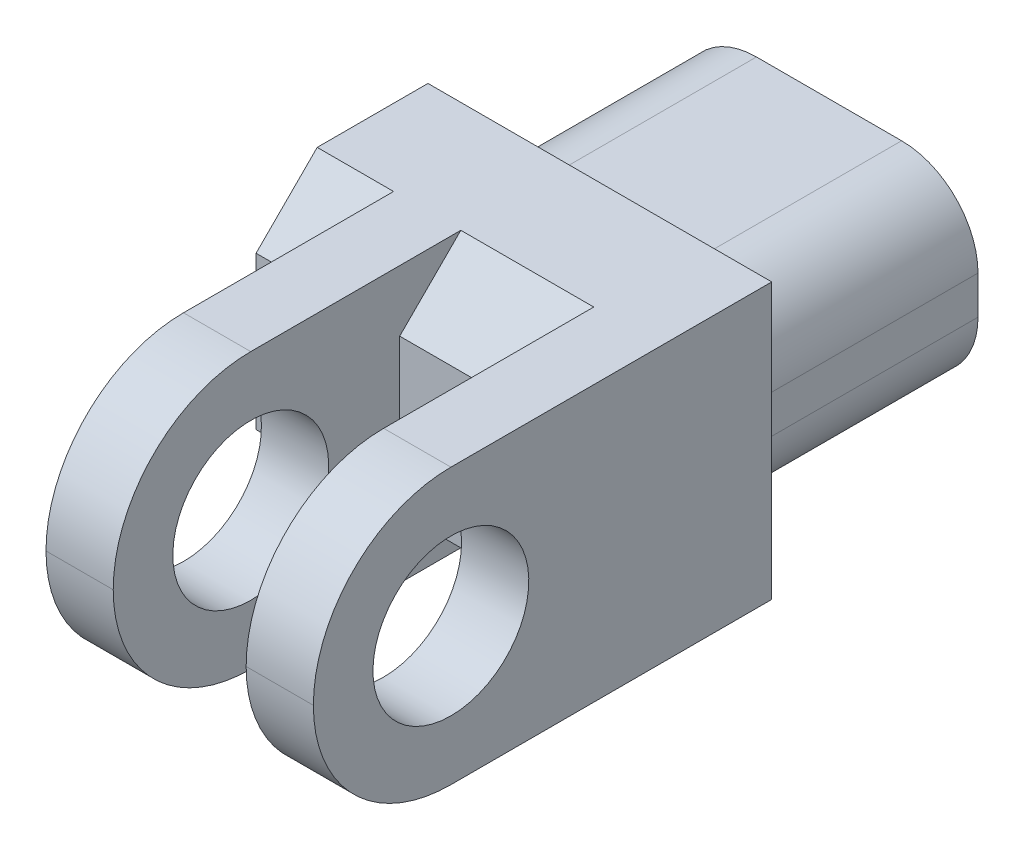
ISO-10303-21;
HEADER;
FILE_DESCRIPTION(('STEP AP214'),'2;1');
FILE_NAME('part.step','',(''),(''),'','','');
FILE_SCHEMA(('AUTOMOTIVE_DESIGN { 1 0 10303 214 1 1 1 1 }'));
ENDSEC;
DATA;
#1=APPLICATION_CONTEXT('core data for automotive mechanical design processes');
#2=APPLICATION_PROTOCOL_DEFINITION('international standard','automotive_design',2000,#1);
#3=PRODUCT_CONTEXT('',#1,'mechanical');
#4=PRODUCT('Part','Part','',(#3));
#5=PRODUCT_RELATED_PRODUCT_CATEGORY('part','',(#4));
#6=PRODUCT_DEFINITION_FORMATION('','',#4);
#7=PRODUCT_DEFINITION_CONTEXT('part definition',#1,'design');
#8=PRODUCT_DEFINITION('design','',#6,#7);
#9=PRODUCT_DEFINITION_SHAPE('','',#8);
#10=(LENGTH_UNIT() NAMED_UNIT(*) SI_UNIT(.MILLI.,.METRE.));
#11=(NAMED_UNIT(*) PLANE_ANGLE_UNIT() SI_UNIT($,.RADIAN.));
#12=(NAMED_UNIT(*) SI_UNIT($,.STERADIAN.) SOLID_ANGLE_UNIT());
#13=UNCERTAINTY_MEASURE_WITH_UNIT(LENGTH_MEASURE(1.E-05),#10,'distance_accuracy_value','');
#14=(GEOMETRIC_REPRESENTATION_CONTEXT(3) GLOBAL_UNCERTAINTY_ASSIGNED_CONTEXT((#13)) GLOBAL_UNIT_ASSIGNED_CONTEXT((#10,
#11,#12)) REPRESENTATION_CONTEXT('',''));
#15=CARTESIAN_POINT('',(0.,0.,0.));
#16=DIRECTION('',(0.,0.,1.));
#17=DIRECTION('',(1.,0.,0.));
#18=AXIS2_PLACEMENT_3D('',#15,#16,#17);
#19=CARTESIAN_POINT('',(-12.3825,-7.9375,-19.05));
#20=DIRECTION('',(-1.,0.,0.));
#21=DIRECTION('',(0.,0.,1.));
#22=AXIS2_PLACEMENT_3D('',#19,#20,#21);
#23=PLANE('',#22);
#24=DIRECTION('',(0.,-1.,0.));
#25=VECTOR('',#24,1.);
#26=CARTESIAN_POINT('',(-12.3825,-7.9375,-19.05));
#27=LINE('',#26,#25);
#28=CARTESIAN_POINT('',(-12.3825,1.5875,-19.05));
#29=VERTEX_POINT('',#28);
#30=CARTESIAN_POINT('',(-12.3825,-1.5875,-19.05));
#31=VERTEX_POINT('',#30);
#32=EDGE_CURVE('E246',#29,#31,#27,.T.);
#33=ORIENTED_EDGE('',*,*,#32,.T.);
#34=DIRECTION('',(0.,0.,1.));
#35=VECTOR('',#34,1.);
#36=CARTESIAN_POINT('',(-12.3825,-1.5875,-19.05));
#37=LINE('',#36,#35);
#38=CARTESIAN_POINT('',(-12.3825,-1.5875,0.));
#39=VERTEX_POINT('',#38);
#40=EDGE_CURVE('E305',#31,#39,#37,.T.);
#41=ORIENTED_EDGE('',*,*,#40,.T.);
#42=DIRECTION('',(0.,-1.,0.));
#43=VECTOR('',#42,1.);
#44=CARTESIAN_POINT('',(-12.3825,-7.9375,0.));
#45=LINE('',#44,#43);
#46=CARTESIAN_POINT('',(-12.3825,1.5875,0.));
#47=VERTEX_POINT('',#46);
#48=EDGE_CURVE('E214',#47,#39,#45,.T.);
#49=ORIENTED_EDGE('',*,*,#48,.F.);
#50=DIRECTION('',(0.,0.,1.));
#51=VECTOR('',#50,1.);
#52=CARTESIAN_POINT('',(-12.3825,1.5875,-19.05));
#53=LINE('',#52,#51);
#54=EDGE_CURVE('E295',#47,#29,#53,.F.);
#55=ORIENTED_EDGE('',*,*,#54,.T.);
#56=EDGE_LOOP('',(#33,#41,#49,#55));
#57=FACE_BOUND('',#56,.T.);
#58=ADVANCED_FACE('F41',(#57),#23,.T.);
#59=CARTESIAN_POINT('',(12.3825,7.9375,-19.05));
#60=DIRECTION('',(0.,1.,0.));
#61=DIRECTION('',(-1.,0.,0.));
#62=AXIS2_PLACEMENT_3D('',#59,#60,#61);
#63=PLANE('',#62);
#64=DIRECTION('',(-1.,0.,0.));
#65=VECTOR('',#64,1.);
#66=CARTESIAN_POINT('',(12.3825,7.9375,-19.05));
#67=LINE('',#66,#65);
#68=CARTESIAN_POINT('',(6.03250000000001,7.9375,-19.05));
#69=VERTEX_POINT('',#68);
#70=CARTESIAN_POINT('',(-6.03249999999999,7.9375,-19.05));
#71=VERTEX_POINT('',#70);
#72=EDGE_CURVE('E256',#69,#71,#67,.T.);
#73=ORIENTED_EDGE('',*,*,#72,.T.);
#74=DIRECTION('',(0.,0.,1.));
#75=VECTOR('',#74,1.);
#76=CARTESIAN_POINT('',(-6.03249999999999,7.9375,-19.05));
#77=LINE('',#76,#75);
#78=CARTESIAN_POINT('',(-6.03249999999999,7.9375,0.));
#79=VERTEX_POINT('',#78);
#80=EDGE_CURVE('E323',#71,#79,#77,.T.);
#81=ORIENTED_EDGE('',*,*,#80,.T.);
#82=DIRECTION('',(-1.,0.,0.));
#83=VECTOR('',#82,1.);
#84=CARTESIAN_POINT('',(12.3825,7.9375,0.));
#85=LINE('',#84,#83);
#86=CARTESIAN_POINT('',(6.03250000000001,7.9375,0.));
#87=VERTEX_POINT('',#86);
#88=EDGE_CURVE('E250',#87,#79,#85,.T.);
#89=ORIENTED_EDGE('',*,*,#88,.F.);
#90=DIRECTION('',(0.,0.,1.));
#91=VECTOR('',#90,1.);
#92=CARTESIAN_POINT('',(6.03250000000001,7.9375,-19.05));
#93=LINE('',#92,#91);
#94=EDGE_CURVE('E321',#87,#69,#93,.F.);
#95=ORIENTED_EDGE('',*,*,#94,.T.);
#96=EDGE_LOOP('',(#73,#81,#89,#95));
#97=FACE_BOUND('',#96,.T.);
#98=ADVANCED_FACE('F466',(#97),#63,.T.);
#99=CARTESIAN_POINT('',(12.3825,-7.9375,-19.05));
#100=DIRECTION('',(1.,0.,0.));
#101=DIRECTION('',(0.,0.,-1.));
#102=AXIS2_PLACEMENT_3D('',#99,#100,#101);
#103=PLANE('',#102);
#104=DIRECTION('',(0.,1.,0.));
#105=VECTOR('',#104,1.);
#106=CARTESIAN_POINT('',(12.3825,-7.9375,0.));
#107=LINE('',#106,#105);
#108=CARTESIAN_POINT('',(12.3825,-1.5875,0.));
#109=VERTEX_POINT('',#108);
#110=CARTESIAN_POINT('',(12.3825,1.5875,0.));
#111=VERTEX_POINT('',#110);
#112=EDGE_CURVE('E265',#109,#111,#107,.T.);
#113=ORIENTED_EDGE('',*,*,#112,.F.);
#114=DIRECTION('',(0.,0.,1.));
#115=VECTOR('',#114,1.);
#116=CARTESIAN_POINT('',(12.3825,-1.5875,-19.05));
#117=LINE('',#116,#115);
#118=CARTESIAN_POINT('',(12.3825,-1.5875,-19.05));
#119=VERTEX_POINT('',#118);
#120=EDGE_CURVE('E329',#109,#119,#117,.F.);
#121=ORIENTED_EDGE('',*,*,#120,.T.);
#122=DIRECTION('',(0.,1.,0.));
#123=VECTOR('',#122,1.);
#124=CARTESIAN_POINT('',(12.3825,-7.9375,-19.05));
#125=LINE('',#124,#123);
#126=CARTESIAN_POINT('',(12.3825,1.5875,-19.05));
#127=VERTEX_POINT('',#126);
#128=EDGE_CURVE('E253',#119,#127,#125,.T.);
#129=ORIENTED_EDGE('',*,*,#128,.T.);
#130=DIRECTION('',(0.,0.,1.));
#131=VECTOR('',#130,1.);
#132=CARTESIAN_POINT('',(12.3825,1.5875,-19.05));
#133=LINE('',#132,#131);
#134=EDGE_CURVE('E326',#127,#111,#133,.T.);
#135=ORIENTED_EDGE('',*,*,#134,.T.);
#136=EDGE_LOOP('',(#113,#121,#129,#135));
#137=FACE_BOUND('',#136,.T.);
#138=ADVANCED_FACE('F472',(#137),#103,.T.);
#139=CARTESIAN_POINT('',(12.3825,-7.9375,-19.05));
#140=DIRECTION('',(0.,-1.,0.));
#141=DIRECTION('',(1.,0.,0.));
#142=AXIS2_PLACEMENT_3D('',#139,#140,#141);
#143=PLANE('',#142);
#144=DIRECTION('',(1.,0.,0.));
#145=VECTOR('',#144,1.);
#146=CARTESIAN_POINT('',(12.3825,-7.9375,0.));
#147=LINE('',#146,#145);
#148=CARTESIAN_POINT('',(-6.0325,-7.9375,0.));
#149=VERTEX_POINT('',#148);
#150=CARTESIAN_POINT('',(6.03250000000001,-7.9375,0.));
#151=VERTEX_POINT('',#150);
#152=EDGE_CURVE('E262',#149,#151,#147,.T.);
#153=ORIENTED_EDGE('',*,*,#152,.F.);
#154=DIRECTION('',(0.,0.,1.));
#155=VECTOR('',#154,1.);
#156=CARTESIAN_POINT('',(-6.0325,-7.9375,-19.05));
#157=LINE('',#156,#155);
#158=CARTESIAN_POINT('',(-6.0325,-7.9375,-19.05));
#159=VERTEX_POINT('',#158);
#160=EDGE_CURVE('E311',#149,#159,#157,.F.);
#161=ORIENTED_EDGE('',*,*,#160,.T.);
#162=DIRECTION('',(1.,0.,0.));
#163=VECTOR('',#162,1.);
#164=CARTESIAN_POINT('',(12.3825,-7.9375,-19.05));
#165=LINE('',#164,#163);
#166=CARTESIAN_POINT('',(6.03250000000001,-7.9375,-19.05));
#167=VERTEX_POINT('',#166);
#168=EDGE_CURVE('E249',#159,#167,#165,.T.);
#169=ORIENTED_EDGE('',*,*,#168,.T.);
#170=DIRECTION('',(0.,0.,1.));
#171=VECTOR('',#170,1.);
#172=CARTESIAN_POINT('',(6.03250000000001,-7.9375,-19.05));
#173=LINE('',#172,#171);
#174=EDGE_CURVE('E308',#167,#151,#173,.T.);
#175=ORIENTED_EDGE('',*,*,#174,.T.);
#176=EDGE_LOOP('',(#153,#161,#169,#175));
#177=FACE_BOUND('',#176,.T.);
#178=ADVANCED_FACE('F477',(#177),#143,.T.);
#179=CARTESIAN_POINT('',(0.,0.,-19.05));
#180=DIRECTION('',(0.,0.,1.));
#181=DIRECTION('',(1.,0.,0.));
#182=AXIS2_PLACEMENT_3D('',#179,#180,#181);
#183=PLANE('',#182);
#184=ORIENTED_EDGE('',*,*,#168,.F.);
#185=CARTESIAN_POINT('',(-6.0325,-1.5875,-19.05));
#186=DIRECTION('',(0.,0.,1.));
#187=DIRECTION('',(1.,0.,0.));
#188=AXIS2_PLACEMENT_3D('',#185,#186,#187);
#189=CIRCLE('',#188,6.35);
#190=EDGE_CURVE('E319',#159,#31,#189,.F.);
#191=ORIENTED_EDGE('',*,*,#190,.T.);
#192=ORIENTED_EDGE('',*,*,#32,.F.);
#193=CARTESIAN_POINT('',(-6.03249999999999,1.5875,-19.05));
#194=DIRECTION('',(0.,0.,1.));
#195=DIRECTION('',(1.,0.,0.));
#196=AXIS2_PLACEMENT_3D('',#193,#194,#195);
#197=CIRCLE('',#196,6.35);
#198=EDGE_CURVE('E317',#29,#71,#197,.F.);
#199=ORIENTED_EDGE('',*,*,#198,.T.);
#200=ORIENTED_EDGE('',*,*,#72,.F.);
#201=CARTESIAN_POINT('',(6.03250000000001,1.5875,-19.05));
#202=DIRECTION('',(0.,0.,1.));
#203=DIRECTION('',(1.,0.,0.));
#204=AXIS2_PLACEMENT_3D('',#201,#202,#203);
#205=CIRCLE('',#204,6.35);
#206=EDGE_CURVE('E313',#69,#127,#205,.F.);
#207=ORIENTED_EDGE('',*,*,#206,.T.);
#208=ORIENTED_EDGE('',*,*,#128,.F.);
#209=CARTESIAN_POINT('',(6.03250000000001,-1.5875,-19.05));
#210=DIRECTION('',(0.,0.,1.));
#211=DIRECTION('',(1.,0.,0.));
#212=AXIS2_PLACEMENT_3D('',#209,#210,#211);
#213=CIRCLE('',#212,6.35);
#214=EDGE_CURVE('E315',#119,#167,#213,.F.);
#215=ORIENTED_EDGE('',*,*,#214,.T.);
#216=EDGE_LOOP('',(#184,#191,#192,#199,#200,#207,#208,#215));
#217=FACE_BOUND('',#216,.T.);
#218=ADVANCED_FACE('F635',(#217),#183,.F.);
#219=CARTESIAN_POINT('',(0.,0.,0.));
#220=DIRECTION('',(0.,0.,1.));
#221=DIRECTION('',(1.,0.,0.));
#222=AXIS2_PLACEMENT_3D('',#219,#220,#221);
#223=PLANE('',#222);
#224=DIRECTION('',(0.,-1.,0.));
#225=VECTOR('',#224,1.);
#226=CARTESIAN_POINT('',(-14.2875,-11.43,0.));
#227=LINE('',#226,#225);
#228=CARTESIAN_POINT('',(-14.2875,11.43,0.));
#229=VERTEX_POINT('',#228);
#230=CARTESIAN_POINT('',(-14.2875,-11.43,0.));
#231=VERTEX_POINT('',#230);
#232=EDGE_CURVE('E222',#229,#231,#227,.T.);
#233=ORIENTED_EDGE('',*,*,#232,.F.);
#234=DIRECTION('',(-1.,0.,0.));
#235=VECTOR('',#234,1.);
#236=CARTESIAN_POINT('',(14.2875,11.43,0.));
#237=LINE('',#236,#235);
#238=CARTESIAN_POINT('',(14.2875,11.43,0.));
#239=VERTEX_POINT('',#238);
#240=EDGE_CURVE('E240',#239,#229,#237,.T.);
#241=ORIENTED_EDGE('',*,*,#240,.F.);
#242=DIRECTION('',(0.,1.,0.));
#243=VECTOR('',#242,1.);
#244=CARTESIAN_POINT('',(14.2875,-11.43,0.));
#245=LINE('',#244,#243);
#246=CARTESIAN_POINT('',(14.2875,-11.43,0.));
#247=VERTEX_POINT('',#246);
#248=EDGE_CURVE('E224',#247,#239,#245,.T.);
#249=ORIENTED_EDGE('',*,*,#248,.F.);
#250=DIRECTION('',(1.,0.,0.));
#251=VECTOR('',#250,1.);
#252=CARTESIAN_POINT('',(14.2875,-11.43,0.));
#253=LINE('',#252,#251);
#254=EDGE_CURVE('E207',#231,#247,#253,.T.);
#255=ORIENTED_EDGE('',*,*,#254,.F.);
#256=EDGE_LOOP('',(#233,#241,#249,#255));
#257=FACE_BOUND('',#256,.T.);
#258=ORIENTED_EDGE('',*,*,#112,.T.);
#259=CARTESIAN_POINT('',(6.03250000000001,1.5875,0.));
#260=DIRECTION('',(0.,0.,1.));
#261=DIRECTION('',(1.,0.,0.));
#262=AXIS2_PLACEMENT_3D('',#259,#260,#261);
#263=CIRCLE('',#262,6.35);
#264=EDGE_CURVE('E337',#111,#87,#263,.T.);
#265=ORIENTED_EDGE('',*,*,#264,.T.);
#266=ORIENTED_EDGE('',*,*,#88,.T.);
#267=CARTESIAN_POINT('',(-6.03249999999999,1.5875,0.));
#268=DIRECTION('',(0.,0.,1.));
#269=DIRECTION('',(1.,0.,0.));
#270=AXIS2_PLACEMENT_3D('',#267,#268,#269);
#271=CIRCLE('',#270,6.35);
#272=EDGE_CURVE('E333',#79,#47,#271,.T.);
#273=ORIENTED_EDGE('',*,*,#272,.T.);
#274=ORIENTED_EDGE('',*,*,#48,.T.);
#275=CARTESIAN_POINT('',(-6.0325,-1.5875,0.));
#276=DIRECTION('',(0.,0.,1.));
#277=DIRECTION('',(1.,0.,0.));
#278=AXIS2_PLACEMENT_3D('',#275,#276,#277);
#279=CIRCLE('',#278,6.35);
#280=EDGE_CURVE('E331',#39,#149,#279,.T.);
#281=ORIENTED_EDGE('',*,*,#280,.T.);
#282=ORIENTED_EDGE('',*,*,#152,.T.);
#283=CARTESIAN_POINT('',(6.03250000000001,-1.5875,0.));
#284=DIRECTION('',(0.,0.,1.));
#285=DIRECTION('',(1.,0.,0.));
#286=AXIS2_PLACEMENT_3D('',#283,#284,#285);
#287=CIRCLE('',#286,6.35);
#288=EDGE_CURVE('E335',#151,#109,#287,.T.);
#289=ORIENTED_EDGE('',*,*,#288,.T.);
#290=EDGE_LOOP('',(#258,#265,#266,#273,#274,#281,#282,#289));
#291=FACE_BOUND('',#290,.T.);
#292=ADVANCED_FACE('F219',(#257,#291),#223,.F.);
#293=CARTESIAN_POINT('',(-14.2875,-11.43,38.1));
#294=DIRECTION('',(1.,0.,0.));
#295=DIRECTION('',(0.,0.,-1.));
#296=AXIS2_PLACEMENT_3D('',#293,#294,#295);
#297=PLANE('',#296);
#298=DIRECTION('',(0.,0.,-1.));
#299=VECTOR('',#298,1.);
#300=CARTESIAN_POINT('',(-14.2875,-11.43,38.1));
#301=LINE('',#300,#299);
#302=CARTESIAN_POINT('',(-14.2875,-11.43,9.20749999999999));
#303=VERTEX_POINT('',#302);
#304=EDGE_CURVE('E203',#303,#231,#301,.T.);
#305=ORIENTED_EDGE('',*,*,#304,.F.);
#306=DIRECTION('',(0.,-0.707106781186547,-0.707106781186548));
#307=VECTOR('',#306,1.);
#308=CARTESIAN_POINT('',(-14.2875,-6.34999999999999,14.2875));
#309=LINE('',#308,#307);
#310=CARTESIAN_POINT('',(-14.2875,-6.34999999999999,14.2875));
#311=VERTEX_POINT('',#310);
#312=EDGE_CURVE('E355',#303,#311,#309,.F.);
#313=ORIENTED_EDGE('',*,*,#312,.T.);
#314=DIRECTION('',(0.,-1.,0.));
#315=VECTOR('',#314,1.);
#316=CARTESIAN_POINT('',(-14.2875,11.43,14.2875));
#317=LINE('',#316,#315);
#318=CARTESIAN_POINT('',(-14.2875,6.34999999999998,14.2875));
#319=VERTEX_POINT('',#318);
#320=EDGE_CURVE('E233',#319,#311,#317,.T.);
#321=ORIENTED_EDGE('',*,*,#320,.F.);
#322=DIRECTION('',(0.,-0.707106781186549,0.707106781186546));
#323=VECTOR('',#322,1.);
#324=CARTESIAN_POINT('',(-14.2875,11.43,9.2075));
#325=LINE('',#324,#323);
#326=CARTESIAN_POINT('',(-14.2875,11.43,9.20750000000001));
#327=VERTEX_POINT('',#326);
#328=EDGE_CURVE('E353',#319,#327,#325,.F.);
#329=ORIENTED_EDGE('',*,*,#328,.T.);
#330=DIRECTION('',(0.,0.,-1.));
#331=VECTOR('',#330,1.);
#332=CARTESIAN_POINT('',(-14.2875,11.43,38.1));
#333=LINE('',#332,#331);
#334=EDGE_CURVE('E228',#327,#229,#333,.T.);
#335=ORIENTED_EDGE('',*,*,#334,.T.);
#336=ORIENTED_EDGE('',*,*,#232,.T.);
#337=EDGE_LOOP('',(#305,#313,#321,#329,#335,#336));
#338=FACE_BOUND('',#337,.T.);
#339=ADVANCED_FACE('F226',(#338),#297,.F.);
#340=CARTESIAN_POINT('',(14.2875,-11.43,38.1));
#341=DIRECTION('',(0.,1.,0.));
#342=DIRECTION('',(-1.,0.,0.));
#343=AXIS2_PLACEMENT_3D('',#340,#341,#342);
#344=PLANE('',#343);
#345=DIRECTION('',(0.,0.,1.));
#346=VECTOR('',#345,1.);
#347=CARTESIAN_POINT('',(8.6995,-11.43,38.1));
#348=LINE('',#347,#346);
#349=CARTESIAN_POINT('',(8.6995,-11.43,9.20749999999998));
#350=VERTEX_POINT('',#349);
#351=CARTESIAN_POINT('',(8.6995,-11.43,26.67));
#352=VERTEX_POINT('',#351);
#353=EDGE_CURVE('E395',#350,#352,#348,.T.);
#354=ORIENTED_EDGE('',*,*,#353,.F.);
#355=DIRECTION('',(-1.,0.,0.));
#356=VECTOR('',#355,1.);
#357=CARTESIAN_POINT('',(14.2875,-11.43,9.20749999999998));
#358=LINE('',#357,#356);
#359=CARTESIAN_POINT('',(-2.3495,-11.43,9.20749999999998));
#360=VERTEX_POINT('',#359);
#361=EDGE_CURVE('E345',#350,#360,#358,.T.);
#362=ORIENTED_EDGE('',*,*,#361,.T.);
#363=DIRECTION('',(0.,0.,-1.));
#364=VECTOR('',#363,1.);
#365=CARTESIAN_POINT('',(-2.3495,-11.43,38.1));
#366=LINE('',#365,#364);
#367=CARTESIAN_POINT('',(-2.3495,-11.43,26.67));
#368=VERTEX_POINT('',#367);
#369=EDGE_CURVE('E299',#368,#360,#366,.T.);
#370=ORIENTED_EDGE('',*,*,#369,.F.);
#371=DIRECTION('',(1.,0.,0.));
#372=VECTOR('',#371,1.);
#373=CARTESIAN_POINT('',(-7.9375,-11.43,26.67));
#374=LINE('',#373,#372);
#375=CARTESIAN_POINT('',(-7.9375,-11.43,26.67));
#376=VERTEX_POINT('',#375);
#377=EDGE_CURVE('E275',#368,#376,#374,.F.);
#378=ORIENTED_EDGE('',*,*,#377,.T.);
#379=DIRECTION('',(0.,0.,1.));
#380=VECTOR('',#379,1.);
#381=CARTESIAN_POINT('',(-7.9375,-11.43,38.1));
#382=LINE('',#381,#380);
#383=CARTESIAN_POINT('',(-7.9375,-11.43,9.20749999999998));
#384=VERTEX_POINT('',#383);
#385=EDGE_CURVE('E384',#384,#376,#382,.T.);
#386=ORIENTED_EDGE('',*,*,#385,.F.);
#387=DIRECTION('',(-1.,0.,0.));
#388=VECTOR('',#387,1.);
#389=CARTESIAN_POINT('',(14.2875,-11.43,9.20749999999997));
#390=LINE('',#389,#388);
#391=EDGE_CURVE('E210',#384,#303,#390,.T.);
#392=ORIENTED_EDGE('',*,*,#391,.T.);
#393=ORIENTED_EDGE('',*,*,#304,.T.);
#394=ORIENTED_EDGE('',*,*,#254,.T.);
#395=DIRECTION('',(0.,0.,-1.));
#396=VECTOR('',#395,1.);
#397=CARTESIAN_POINT('',(14.2875,-11.43,38.1));
#398=LINE('',#397,#396);
#399=CARTESIAN_POINT('',(14.2875,-11.43,26.67));
#400=VERTEX_POINT('',#399);
#401=EDGE_CURVE('E215',#400,#247,#398,.T.);
#402=ORIENTED_EDGE('',*,*,#401,.F.);
#403=DIRECTION('',(1.,0.,0.));
#404=VECTOR('',#403,1.);
#405=CARTESIAN_POINT('',(8.6995,-11.43,26.67));
#406=LINE('',#405,#404);
#407=EDGE_CURVE('E273',#400,#352,#406,.F.);
#408=ORIENTED_EDGE('',*,*,#407,.T.);
#409=EDGE_LOOP('',(#354,#362,#370,#378,#386,#392,#393,#394,#402,#408));
#410=FACE_BOUND('',#409,.T.);
#411=ADVANCED_FACE('F205',(#410),#344,.F.);
#412=CARTESIAN_POINT('',(14.2875,-11.43,38.1));
#413=DIRECTION('',(-1.,0.,0.));
#414=DIRECTION('',(0.,0.,1.));
#415=AXIS2_PLACEMENT_3D('',#412,#413,#414);
#416=PLANE('',#415);
#417=CARTESIAN_POINT('',(14.2875,0.,26.67));
#418=DIRECTION('',(-1.,0.,0.));
#419=DIRECTION('',(0.,-1.,0.));
#420=AXIS2_PLACEMENT_3D('',#417,#418,#419);
#421=CIRCLE('',#420,6.477);
#422=CARTESIAN_POINT('',(14.2875,-6.477,26.67));
#423=VERTEX_POINT('',#422);
#424=EDGE_CURVE('E439',#423,#423,#421,.T.);
#425=ORIENTED_EDGE('',*,*,#424,.T.);
#426=EDGE_LOOP('',(#425));
#427=FACE_BOUND('',#426,.T.);
#428=DIRECTION('',(0.,0.,-1.));
#429=VECTOR('',#428,1.);
#430=CARTESIAN_POINT('',(14.2875,11.43,38.1));
#431=LINE('',#430,#429);
#432=CARTESIAN_POINT('',(14.2875,11.43,26.67));
#433=VERTEX_POINT('',#432);
#434=EDGE_CURVE('E243',#433,#239,#431,.T.);
#435=ORIENTED_EDGE('',*,*,#434,.F.);
#436=CARTESIAN_POINT('',(14.2875,0.,26.67));
#437=DIRECTION('',(-1.,0.,0.));
#438=DIRECTION('',(0.,0.,1.));
#439=AXIS2_PLACEMENT_3D('',#436,#437,#438);
#440=CIRCLE('',#439,11.43);
#441=CARTESIAN_POINT('',(14.2875,0.,38.1));
#442=VERTEX_POINT('',#441);
#443=EDGE_CURVE('E293',#433,#442,#440,.F.);
#444=ORIENTED_EDGE('',*,*,#443,.T.);
#445=CARTESIAN_POINT('',(14.2875,0.,26.67));
#446=DIRECTION('',(-1.,0.,0.));
#447=DIRECTION('',(0.,0.,1.));
#448=AXIS2_PLACEMENT_3D('',#445,#446,#447);
#449=CIRCLE('',#448,11.43);
#450=EDGE_CURVE('E291',#442,#400,#449,.F.);
#451=ORIENTED_EDGE('',*,*,#450,.T.);
#452=ORIENTED_EDGE('',*,*,#401,.T.);
#453=ORIENTED_EDGE('',*,*,#248,.T.);
#454=EDGE_LOOP('',(#435,#444,#451,#452,#453));
#455=FACE_BOUND('',#454,.T.);
#456=ADVANCED_FACE('F414',(#427,#455),#416,.F.);
#457=CARTESIAN_POINT('',(14.2875,11.43,38.1));
#458=DIRECTION('',(0.,-1.,0.));
#459=DIRECTION('',(1.,0.,0.));
#460=AXIS2_PLACEMENT_3D('',#457,#458,#459);
#461=PLANE('',#460);
#462=ORIENTED_EDGE('',*,*,#334,.F.);
#463=DIRECTION('',(1.,0.,0.));
#464=VECTOR('',#463,1.);
#465=CARTESIAN_POINT('',(14.2875,11.43,9.20749999999999));
#466=LINE('',#465,#464);
#467=CARTESIAN_POINT('',(-7.9375,11.43,9.2075));
#468=VERTEX_POINT('',#467);
#469=EDGE_CURVE('E360',#327,#468,#466,.T.);
#470=ORIENTED_EDGE('',*,*,#469,.T.);
#471=DIRECTION('',(0.,0.,1.));
#472=VECTOR('',#471,1.);
#473=CARTESIAN_POINT('',(-7.9375,11.43,38.1));
#474=LINE('',#473,#472);
#475=CARTESIAN_POINT('',(-7.9375,11.43,26.67));
#476=VERTEX_POINT('',#475);
#477=EDGE_CURVE('E57',#468,#476,#474,.T.);
#478=ORIENTED_EDGE('',*,*,#477,.T.);
#479=DIRECTION('',(-1.,0.,0.));
#480=VECTOR('',#479,1.);
#481=CARTESIAN_POINT('',(-2.3495,11.43,26.67));
#482=LINE('',#481,#480);
#483=CARTESIAN_POINT('',(-2.3495,11.43,26.67));
#484=VERTEX_POINT('',#483);
#485=EDGE_CURVE('E285',#476,#484,#482,.F.);
#486=ORIENTED_EDGE('',*,*,#485,.T.);
#487=DIRECTION('',(0.,0.,-1.));
#488=VECTOR('',#487,1.);
#489=CARTESIAN_POINT('',(-2.3495,11.43,38.1));
#490=LINE('',#489,#488);
#491=CARTESIAN_POINT('',(-2.34950000000001,11.43,9.20749999999999));
#492=VERTEX_POINT('',#491);
#493=EDGE_CURVE('E389',#484,#492,#490,.T.);
#494=ORIENTED_EDGE('',*,*,#493,.T.);
#495=DIRECTION('',(1.,0.,0.));
#496=VECTOR('',#495,1.);
#497=CARTESIAN_POINT('',(14.2875,11.43,9.20749999999999));
#498=LINE('',#497,#496);
#499=CARTESIAN_POINT('',(8.6995,11.43,9.2075));
#500=VERTEX_POINT('',#499);
#501=EDGE_CURVE('E357',#492,#500,#498,.T.);
#502=ORIENTED_EDGE('',*,*,#501,.T.);
#503=DIRECTION('',(0.,0.,1.));
#504=VECTOR('',#503,1.);
#505=CARTESIAN_POINT('',(8.6995,11.43,38.1));
#506=LINE('',#505,#504);
#507=CARTESIAN_POINT('',(8.6995,11.43,26.67));
#508=VERTEX_POINT('',#507);
#509=EDGE_CURVE('E65',#500,#508,#506,.T.);
#510=ORIENTED_EDGE('',*,*,#509,.T.);
#511=DIRECTION('',(-1.,0.,0.));
#512=VECTOR('',#511,1.);
#513=CARTESIAN_POINT('',(14.2875,11.43,26.67));
#514=LINE('',#513,#512);
#515=EDGE_CURVE('E282',#508,#433,#514,.F.);
#516=ORIENTED_EDGE('',*,*,#515,.T.);
#517=ORIENTED_EDGE('',*,*,#434,.T.);
#518=ORIENTED_EDGE('',*,*,#240,.T.);
#519=EDGE_LOOP('',(#462,#470,#478,#486,#494,#502,#510,#516,#517,#518));
#520=FACE_BOUND('',#519,.T.);
#521=ADVANCED_FACE('F412',(#520),#461,.F.);
#522=CARTESIAN_POINT('',(-2.3495,11.43,38.1));
#523=DIRECTION('',(-1.,0.,0.));
#524=DIRECTION('',(0.,-1.,0.));
#525=AXIS2_PLACEMENT_3D('',#522,#523,#524);
#526=PLANE('',#525);
#527=CARTESIAN_POINT('',(-2.3495,0.,26.67));
#528=DIRECTION('',(-1.,0.,0.));
#529=DIRECTION('',(0.,-1.,0.));
#530=AXIS2_PLACEMENT_3D('',#527,#528,#529);
#531=CIRCLE('',#530,6.477);
#532=CARTESIAN_POINT('',(-2.3495,-6.477,26.67));
#533=VERTEX_POINT('',#532);
#534=EDGE_CURVE('E303',#533,#533,#531,.T.);
#535=ORIENTED_EDGE('',*,*,#534,.T.);
#536=EDGE_LOOP('',(#535));
#537=FACE_BOUND('',#536,.T.);
#538=CARTESIAN_POINT('',(-2.3495,0.,26.67));
#539=DIRECTION('',(-1.,0.,0.));
#540=DIRECTION('',(0.,-1.,0.));
#541=AXIS2_PLACEMENT_3D('',#538,#539,#540);
#542=CIRCLE('',#541,11.43);
#543=CARTESIAN_POINT('',(-2.3495,0.,38.1));
#544=VERTEX_POINT('',#543);
#545=EDGE_CURVE('E259',#484,#544,#542,.F.);
#546=ORIENTED_EDGE('',*,*,#545,.T.);
#547=CARTESIAN_POINT('',(-2.3495,0.,26.67));
#548=DIRECTION('',(-1.,0.,0.));
#549=DIRECTION('',(0.,-1.,0.));
#550=AXIS2_PLACEMENT_3D('',#547,#548,#549);
#551=CIRCLE('',#550,11.43);
#552=EDGE_CURVE('E271',#544,#368,#551,.F.);
#553=ORIENTED_EDGE('',*,*,#552,.T.);
#554=ORIENTED_EDGE('',*,*,#369,.T.);
#555=DIRECTION('',(0.,-0.707106781186546,-0.707106781186549));
#556=VECTOR('',#555,1.);
#557=CARTESIAN_POINT('',(-2.3495,14.44625,35.08375));
#558=LINE('',#557,#556);
#559=CARTESIAN_POINT('',(-2.3495,-6.34999999999999,14.2875));
#560=VERTEX_POINT('',#559);
#561=EDGE_CURVE('E366',#360,#560,#558,.F.);
#562=ORIENTED_EDGE('',*,*,#561,.T.);
#563=DIRECTION('',(0.,-1.,0.));
#564=VECTOR('',#563,1.);
#565=CARTESIAN_POINT('',(-2.34950000000001,11.43,14.2875));
#566=LINE('',#565,#564);
#567=CARTESIAN_POINT('',(-2.3495,6.34999999999998,14.2875));
#568=VERTEX_POINT('',#567);
#569=EDGE_CURVE('E236',#568,#560,#566,.T.);
#570=ORIENTED_EDGE('',*,*,#569,.F.);
#571=DIRECTION('',(0.,-0.707106781186548,0.707106781186547));
#572=VECTOR('',#571,1.);
#573=CARTESIAN_POINT('',(-2.3495,-3.01625,23.65375));
#574=LINE('',#573,#572);
#575=EDGE_CURVE('E11',#568,#492,#574,.F.);
#576=ORIENTED_EDGE('',*,*,#575,.T.);
#577=ORIENTED_EDGE('',*,*,#493,.F.);
#578=EDGE_LOOP('',(#546,#553,#554,#562,#570,#576,#577));
#579=FACE_BOUND('',#578,.T.);
#580=ADVANCED_FACE('F388',(#537,#579),#526,.F.);
#581=CARTESIAN_POINT('',(8.6995,11.43,38.1));
#582=DIRECTION('',(1.,0.,0.));
#583=DIRECTION('',(0.,1.,0.));
#584=AXIS2_PLACEMENT_3D('',#581,#582,#583);
#585=PLANE('',#584);
#586=CARTESIAN_POINT('',(8.6995,0.,26.67));
#587=DIRECTION('',(1.,0.,0.));
#588=DIRECTION('',(0.,1.,0.));
#589=AXIS2_PLACEMENT_3D('',#586,#587,#588);
#590=CIRCLE('',#589,6.477);
#591=CARTESIAN_POINT('',(8.6995,6.477,26.67));
#592=VERTEX_POINT('',#591);
#593=EDGE_CURVE('E436',#592,#592,#590,.T.);
#594=ORIENTED_EDGE('',*,*,#593,.T.);
#595=EDGE_LOOP('',(#594));
#596=FACE_BOUND('',#595,.T.);
#597=CARTESIAN_POINT('',(8.6995,0.,26.67));
#598=DIRECTION('',(1.,0.,0.));
#599=DIRECTION('',(0.,1.,0.));
#600=AXIS2_PLACEMENT_3D('',#597,#598,#599);
#601=CIRCLE('',#600,11.43);
#602=CARTESIAN_POINT('',(8.6995,0.,38.1));
#603=VERTEX_POINT('',#602);
#604=EDGE_CURVE('E287',#352,#603,#601,.F.);
#605=ORIENTED_EDGE('',*,*,#604,.T.);
#606=CARTESIAN_POINT('',(8.6995,0.,26.67));
#607=DIRECTION('',(1.,0.,0.));
#608=DIRECTION('',(0.,1.,0.));
#609=AXIS2_PLACEMENT_3D('',#606,#607,#608);
#610=CIRCLE('',#609,11.43);
#611=EDGE_CURVE('E289',#603,#508,#610,.F.);
#612=ORIENTED_EDGE('',*,*,#611,.T.);
#613=ORIENTED_EDGE('',*,*,#509,.F.);
#614=DIRECTION('',(0.,0.707106781186548,-0.707106781186547));
#615=VECTOR('',#614,1.);
#616=CARTESIAN_POINT('',(8.6995,-3.01625,23.65375));
#617=LINE('',#616,#615);
#618=CARTESIAN_POINT('',(8.6995,6.34999999999998,14.2875));
#619=VERTEX_POINT('',#618);
#620=EDGE_CURVE('E50',#500,#619,#617,.F.);
#621=ORIENTED_EDGE('',*,*,#620,.T.);
#622=DIRECTION('',(0.,-1.,0.));
#623=VECTOR('',#622,1.);
#624=CARTESIAN_POINT('',(8.6995,11.43,14.2875));
#625=LINE('',#624,#623);
#626=CARTESIAN_POINT('',(8.6995,-6.34999999999999,14.2875));
#627=VERTEX_POINT('',#626);
#628=EDGE_CURVE('E375',#619,#627,#625,.T.);
#629=ORIENTED_EDGE('',*,*,#628,.T.);
#630=DIRECTION('',(0.,0.707106781186546,0.707106781186549));
#631=VECTOR('',#630,1.);
#632=CARTESIAN_POINT('',(8.6995,14.44625,35.08375));
#633=LINE('',#632,#631);
#634=EDGE_CURVE('E363',#627,#350,#633,.F.);
#635=ORIENTED_EDGE('',*,*,#634,.T.);
#636=ORIENTED_EDGE('',*,*,#353,.T.);
#637=EDGE_LOOP('',(#605,#612,#613,#621,#629,#635,#636));
#638=FACE_BOUND('',#637,.T.);
#639=ADVANCED_FACE('F374',(#596,#638),#585,.F.);
#640=CARTESIAN_POINT('',(-2.34950000000001,11.43,14.2875));
#641=DIRECTION('',(0.,0.,-1.));
#642=DIRECTION('',(-1.,0.,0.));
#643=AXIS2_PLACEMENT_3D('',#640,#641,#642);
#644=PLANE('',#643);
#645=ORIENTED_EDGE('',*,*,#569,.T.);
#646=DIRECTION('',(1.,0.,0.));
#647=VECTOR('',#646,1.);
#648=CARTESIAN_POINT('',(-2.3495,-6.34999999999999,14.2875));
#649=LINE('',#648,#647);
#650=EDGE_CURVE('E341',#560,#627,#649,.T.);
#651=ORIENTED_EDGE('',*,*,#650,.T.);
#652=ORIENTED_EDGE('',*,*,#628,.F.);
#653=DIRECTION('',(-1.,0.,0.));
#654=VECTOR('',#653,1.);
#655=CARTESIAN_POINT('',(-2.3495,6.34999999999998,14.2875));
#656=LINE('',#655,#654);
#657=EDGE_CURVE('E339',#619,#568,#656,.T.);
#658=ORIENTED_EDGE('',*,*,#657,.T.);
#659=EDGE_LOOP('',(#645,#651,#652,#658));
#660=FACE_BOUND('',#659,.T.);
#661=ADVANCED_FACE('F381',(#660),#644,.F.);
#662=CARTESIAN_POINT('',(-7.9375,11.43,38.1));
#663=DIRECTION('',(1.,0.,0.));
#664=DIRECTION('',(0.,1.,0.));
#665=AXIS2_PLACEMENT_3D('',#662,#663,#664);
#666=PLANE('',#665);
#667=CARTESIAN_POINT('',(-7.9375,0.,26.67));
#668=DIRECTION('',(-1.,0.,0.));
#669=DIRECTION('',(0.,-1.,0.));
#670=AXIS2_PLACEMENT_3D('',#667,#668,#669);
#671=CIRCLE('',#670,6.477);
#672=CARTESIAN_POINT('',(-7.9375,-6.477,26.67));
#673=VERTEX_POINT('',#672);
#674=EDGE_CURVE('E440',#673,#673,#671,.T.);
#675=ORIENTED_EDGE('',*,*,#674,.F.);
#676=EDGE_LOOP('',(#675));
#677=FACE_BOUND('',#676,.T.);
#678=ORIENTED_EDGE('',*,*,#385,.T.);
#679=CARTESIAN_POINT('',(-7.9375,0.,26.67));
#680=DIRECTION('',(1.,0.,0.));
#681=DIRECTION('',(0.,1.,0.));
#682=AXIS2_PLACEMENT_3D('',#679,#680,#681);
#683=CIRCLE('',#682,11.43);
#684=CARTESIAN_POINT('',(-7.9375,0.,38.1));
#685=VERTEX_POINT('',#684);
#686=EDGE_CURVE('E280',#376,#685,#683,.F.);
#687=ORIENTED_EDGE('',*,*,#686,.T.);
#688=CARTESIAN_POINT('',(-7.9375,0.,26.67));
#689=DIRECTION('',(1.,0.,0.));
#690=DIRECTION('',(0.,1.,0.));
#691=AXIS2_PLACEMENT_3D('',#688,#689,#690);
#692=CIRCLE('',#691,11.43);
#693=EDGE_CURVE('E278',#685,#476,#692,.F.);
#694=ORIENTED_EDGE('',*,*,#693,.T.);
#695=ORIENTED_EDGE('',*,*,#477,.F.);
#696=DIRECTION('',(0.,0.707106781186549,-0.707106781186546));
#697=VECTOR('',#696,1.);
#698=CARTESIAN_POINT('',(-7.9375,-3.01625,23.65375));
#699=LINE('',#698,#697);
#700=CARTESIAN_POINT('',(-7.9375,6.34999999999998,14.2875));
#701=VERTEX_POINT('',#700);
#702=EDGE_CURVE('E371',#468,#701,#699,.F.);
#703=ORIENTED_EDGE('',*,*,#702,.T.);
#704=DIRECTION('',(0.,-1.,0.));
#705=VECTOR('',#704,1.);
#706=CARTESIAN_POINT('',(-7.9375,11.43,14.2875));
#707=LINE('',#706,#705);
#708=CARTESIAN_POINT('',(-7.9375,-6.34999999999999,14.2875));
#709=VERTEX_POINT('',#708);
#710=EDGE_CURVE('E230',#701,#709,#707,.T.);
#711=ORIENTED_EDGE('',*,*,#710,.T.);
#712=DIRECTION('',(0.,0.707106781186547,0.707106781186548));
#713=VECTOR('',#712,1.);
#714=CARTESIAN_POINT('',(-7.9375,14.44625,35.08375));
#715=LINE('',#714,#713);
#716=EDGE_CURVE('E368',#709,#384,#715,.F.);
#717=ORIENTED_EDGE('',*,*,#716,.T.);
#718=EDGE_LOOP('',(#678,#687,#694,#695,#703,#711,#717));
#719=FACE_BOUND('',#718,.T.);
#720=ADVANCED_FACE('F422',(#677,#719),#666,.F.);
#721=CARTESIAN_POINT('',(-14.2875,11.43,14.2875));
#722=DIRECTION('',(0.,0.,-1.));
#723=DIRECTION('',(-1.,0.,0.));
#724=AXIS2_PLACEMENT_3D('',#721,#722,#723);
#725=PLANE('',#724);
#726=ORIENTED_EDGE('',*,*,#320,.T.);
#727=DIRECTION('',(1.,0.,0.));
#728=VECTOR('',#727,1.);
#729=CARTESIAN_POINT('',(-14.2875,-6.34999999999999,14.2875));
#730=LINE('',#729,#728);
#731=EDGE_CURVE('E350',#311,#709,#730,.T.);
#732=ORIENTED_EDGE('',*,*,#731,.T.);
#733=ORIENTED_EDGE('',*,*,#710,.F.);
#734=DIRECTION('',(-1.,0.,0.));
#735=VECTOR('',#734,1.);
#736=CARTESIAN_POINT('',(-14.2875,6.34999999999998,14.2875));
#737=LINE('',#736,#735);
#738=EDGE_CURVE('E348',#701,#319,#737,.T.);
#739=ORIENTED_EDGE('',*,*,#738,.T.);
#740=EDGE_LOOP('',(#726,#732,#733,#739));
#741=FACE_BOUND('',#740,.T.);
#742=ADVANCED_FACE('F425',(#741),#725,.F.);
#743=CARTESIAN_POINT('',(0.,0.,26.67));
#744=DIRECTION('',(1.,0.,0.));
#745=DIRECTION('',(0.,1.,0.));
#746=AXIS2_PLACEMENT_3D('',#743,#744,#745);
#747=CYLINDRICAL_SURFACE('',#746,11.43);
#748=ORIENTED_EDGE('',*,*,#485,.F.);
#749=ORIENTED_EDGE('',*,*,#693,.F.);
#750=DIRECTION('',(-1.,0.,0.));
#751=VECTOR('',#750,1.);
#752=CARTESIAN_POINT('',(-7.9375,0.,38.1));
#753=LINE('',#752,#751);
#754=EDGE_CURVE('E296',#544,#685,#753,.T.);
#755=ORIENTED_EDGE('',*,*,#754,.F.);
#756=ORIENTED_EDGE('',*,*,#545,.F.);
#757=EDGE_LOOP('',(#748,#749,#755,#756));
#758=FACE_BOUND('',#757,.T.);
#759=ADVANCED_FACE('F482',(#758),#747,.T.);
#760=CARTESIAN_POINT('',(0.,0.,26.67));
#761=DIRECTION('',(-1.,0.,0.));
#762=DIRECTION('',(0.,-1.,0.));
#763=AXIS2_PLACEMENT_3D('',#760,#761,#762);
#764=CYLINDRICAL_SURFACE('',#763,11.43);
#765=ORIENTED_EDGE('',*,*,#686,.F.);
#766=ORIENTED_EDGE('',*,*,#377,.F.);
#767=ORIENTED_EDGE('',*,*,#552,.F.);
#768=ORIENTED_EDGE('',*,*,#754,.T.);
#769=EDGE_LOOP('',(#765,#766,#767,#768));
#770=FACE_BOUND('',#769,.T.);
#771=ADVANCED_FACE('F479',(#770),#764,.T.);
#772=CARTESIAN_POINT('',(0.,0.,26.67));
#773=DIRECTION('',(-1.,0.,0.));
#774=DIRECTION('',(0.,-1.,0.));
#775=AXIS2_PLACEMENT_3D('',#772,#773,#774);
#776=CYLINDRICAL_SURFACE('',#775,11.43);
#777=ORIENTED_EDGE('',*,*,#407,.F.);
#778=ORIENTED_EDGE('',*,*,#450,.F.);
#779=DIRECTION('',(1.,0.,0.));
#780=VECTOR('',#779,1.);
#781=CARTESIAN_POINT('',(14.2875,0.,38.1));
#782=LINE('',#781,#780);
#783=EDGE_CURVE('E300',#603,#442,#782,.T.);
#784=ORIENTED_EDGE('',*,*,#783,.F.);
#785=ORIENTED_EDGE('',*,*,#604,.F.);
#786=EDGE_LOOP('',(#777,#778,#784,#785));
#787=FACE_BOUND('',#786,.T.);
#788=ADVANCED_FACE('F406',(#787),#776,.T.);
#789=CARTESIAN_POINT('',(0.,0.,26.67));
#790=DIRECTION('',(1.,0.,0.));
#791=DIRECTION('',(0.,1.,0.));
#792=AXIS2_PLACEMENT_3D('',#789,#790,#791);
#793=CYLINDRICAL_SURFACE('',#792,11.43);
#794=ORIENTED_EDGE('',*,*,#443,.F.);
#795=ORIENTED_EDGE('',*,*,#515,.F.);
#796=ORIENTED_EDGE('',*,*,#611,.F.);
#797=ORIENTED_EDGE('',*,*,#783,.T.);
#798=EDGE_LOOP('',(#794,#795,#796,#797));
#799=FACE_BOUND('',#798,.T.);
#800=ADVANCED_FACE('F410',(#799),#793,.T.);
#801=CARTESIAN_POINT('',(14.2875,0.,26.67));
#802=DIRECTION('',(-1.,0.,0.));
#803=DIRECTION('',(0.,-1.,0.));
#804=AXIS2_PLACEMENT_3D('',#801,#802,#803);
#805=CYLINDRICAL_SURFACE('',#804,6.477);
#806=ORIENTED_EDGE('',*,*,#674,.T.);
#807=EDGE_LOOP('',(#806));
#808=FACE_BOUND('',#807,.T.);
#809=ORIENTED_EDGE('',*,*,#534,.F.);
#810=EDGE_LOOP('',(#809));
#811=FACE_BOUND('',#810,.T.);
#812=ADVANCED_FACE('F451',(#808,#811),#805,.F.);
#813=ORIENTED_EDGE('',*,*,#424,.F.);
#814=EDGE_LOOP('',(#813));
#815=FACE_BOUND('',#814,.T.);
#816=ORIENTED_EDGE('',*,*,#593,.F.);
#817=EDGE_LOOP('',(#816));
#818=FACE_BOUND('',#817,.T.);
#819=ADVANCED_FACE('F447',(#815,#818),#805,.F.);
#820=CARTESIAN_POINT('',(-6.0325,-1.5875,-19.05));
#821=DIRECTION('',(0.,0.,1.));
#822=DIRECTION('',(1.,0.,0.));
#823=AXIS2_PLACEMENT_3D('',#820,#821,#822);
#824=CYLINDRICAL_SURFACE('',#823,6.35);
#825=ORIENTED_EDGE('',*,*,#190,.F.);
#826=ORIENTED_EDGE('',*,*,#160,.F.);
#827=ORIENTED_EDGE('',*,*,#280,.F.);
#828=ORIENTED_EDGE('',*,*,#40,.F.);
#829=EDGE_LOOP('',(#825,#826,#827,#828));
#830=FACE_BOUND('',#829,.T.);
#831=ADVANCED_FACE('F450',(#830),#824,.T.);
#832=CARTESIAN_POINT('',(-6.03249999999999,1.5875,-19.05));
#833=DIRECTION('',(0.,0.,1.));
#834=DIRECTION('',(1.,0.,0.));
#835=AXIS2_PLACEMENT_3D('',#832,#833,#834);
#836=CYLINDRICAL_SURFACE('',#835,6.35);
#837=ORIENTED_EDGE('',*,*,#198,.F.);
#838=ORIENTED_EDGE('',*,*,#54,.F.);
#839=ORIENTED_EDGE('',*,*,#272,.F.);
#840=ORIENTED_EDGE('',*,*,#80,.F.);
#841=EDGE_LOOP('',(#837,#838,#839,#840));
#842=FACE_BOUND('',#841,.T.);
#843=ADVANCED_FACE('F493',(#842),#836,.T.);
#844=CARTESIAN_POINT('',(6.03250000000001,-1.5875,-19.05));
#845=DIRECTION('',(0.,0.,1.));
#846=DIRECTION('',(1.,0.,0.));
#847=AXIS2_PLACEMENT_3D('',#844,#845,#846);
#848=CYLINDRICAL_SURFACE('',#847,6.35);
#849=ORIENTED_EDGE('',*,*,#214,.F.);
#850=ORIENTED_EDGE('',*,*,#120,.F.);
#851=ORIENTED_EDGE('',*,*,#288,.F.);
#852=ORIENTED_EDGE('',*,*,#174,.F.);
#853=EDGE_LOOP('',(#849,#850,#851,#852));
#854=FACE_BOUND('',#853,.T.);
#855=ADVANCED_FACE('F497',(#854),#848,.T.);
#856=CARTESIAN_POINT('',(6.03250000000001,1.5875,-19.05));
#857=DIRECTION('',(0.,0.,1.));
#858=DIRECTION('',(1.,0.,0.));
#859=AXIS2_PLACEMENT_3D('',#856,#857,#858);
#860=CYLINDRICAL_SURFACE('',#859,6.35);
#861=ORIENTED_EDGE('',*,*,#206,.F.);
#862=ORIENTED_EDGE('',*,*,#94,.F.);
#863=ORIENTED_EDGE('',*,*,#264,.F.);
#864=ORIENTED_EDGE('',*,*,#134,.F.);
#865=EDGE_LOOP('',(#861,#862,#863,#864));
#866=FACE_BOUND('',#865,.T.);
#867=ADVANCED_FACE('F501',(#866),#860,.T.);
#868=CARTESIAN_POINT('',(-2.3495,-6.34999999999999,14.2875));
#869=DIRECTION('',(0.,0.707106781186549,-0.707106781186546));
#870=DIRECTION('',(1.,0.,0.));
#871=AXIS2_PLACEMENT_3D('',#868,#869,#870);
#872=PLANE('',#871);
#873=ORIENTED_EDGE('',*,*,#561,.F.);
#874=ORIENTED_EDGE('',*,*,#361,.F.);
#875=ORIENTED_EDGE('',*,*,#634,.F.);
#876=ORIENTED_EDGE('',*,*,#650,.F.);
#877=EDGE_LOOP('',(#873,#874,#875,#876));
#878=FACE_BOUND('',#877,.T.);
#879=ADVANCED_FACE('F505',(#878),#872,.F.);
#880=CARTESIAN_POINT('',(-14.2875,-6.34999999999999,14.2875));
#881=DIRECTION('',(0.,0.707106781186548,-0.707106781186547));
#882=DIRECTION('',(1.,0.,0.));
#883=AXIS2_PLACEMENT_3D('',#880,#881,#882);
#884=PLANE('',#883);
#885=ORIENTED_EDGE('',*,*,#312,.F.);
#886=ORIENTED_EDGE('',*,*,#391,.F.);
#887=ORIENTED_EDGE('',*,*,#716,.F.);
#888=ORIENTED_EDGE('',*,*,#731,.F.);
#889=EDGE_LOOP('',(#885,#886,#887,#888));
#890=FACE_BOUND('',#889,.T.);
#891=ADVANCED_FACE('F429',(#890),#884,.F.);
#892=CARTESIAN_POINT('',(14.2875,11.43,9.20749999999999));
#893=DIRECTION('',(0.,-0.707106781186546,-0.707106781186549));
#894=DIRECTION('',(1.,0.,0.));
#895=AXIS2_PLACEMENT_3D('',#892,#893,#894);
#896=PLANE('',#895);
#897=ORIENTED_EDGE('',*,*,#328,.F.);
#898=ORIENTED_EDGE('',*,*,#738,.F.);
#899=ORIENTED_EDGE('',*,*,#702,.F.);
#900=ORIENTED_EDGE('',*,*,#469,.F.);
#901=EDGE_LOOP('',(#897,#898,#899,#900));
#902=FACE_BOUND('',#901,.T.);
#903=ADVANCED_FACE('F418',(#902),#896,.F.);
#904=CARTESIAN_POINT('',(14.2875,11.43,9.2075));
#905=DIRECTION('',(0.,-0.707106781186547,-0.707106781186548));
#906=DIRECTION('',(1.,0.,0.));
#907=AXIS2_PLACEMENT_3D('',#904,#905,#906);
#908=PLANE('',#907);
#909=ORIENTED_EDGE('',*,*,#575,.F.);
#910=ORIENTED_EDGE('',*,*,#657,.F.);
#911=ORIENTED_EDGE('',*,*,#620,.F.);
#912=ORIENTED_EDGE('',*,*,#501,.F.);
#913=EDGE_LOOP('',(#909,#910,#911,#912));
#914=FACE_BOUND('',#913,.T.);
#915=ADVANCED_FACE('F44',(#914),#908,.F.);
#916=CLOSED_SHELL('',(#58,#98,#138,#178,#218,#292,#339,#411,#456,#521,#580,#639,#661,#720,#742,
#759,#771,#788,#800,#812,#819,#831,#843,#855,#867,#879,#891,#903,#915));
#917=MANIFOLD_SOLID_BREP('B2',#916);
#918=ADVANCED_BREP_SHAPE_REPRESENTATION('',(#18,#917),#14);
#919=SHAPE_DEFINITION_REPRESENTATION(#9,#918);
ENDSEC;
END-ISO-10303-21;
